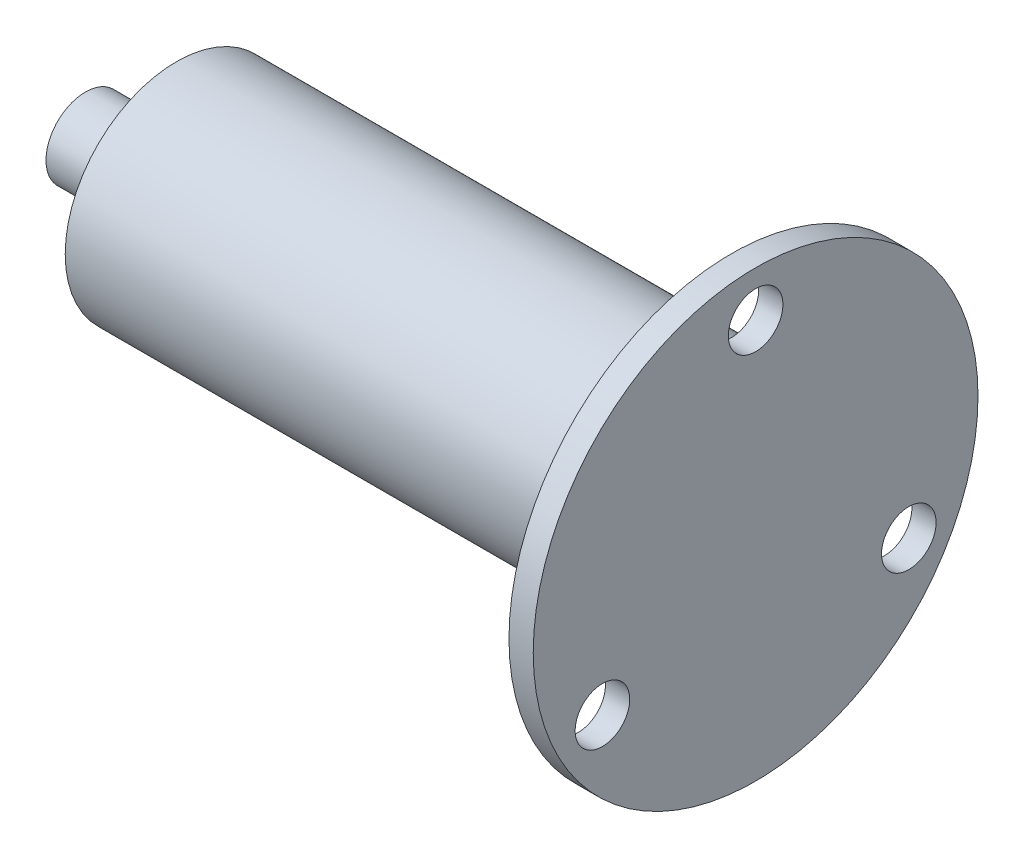
ISO-10303-21;
HEADER;
FILE_DESCRIPTION(('STEP AP214'),'2;1');
FILE_NAME('part.step','',(''),(''),'','','');
FILE_SCHEMA(('AUTOMOTIVE_DESIGN { 1 0 10303 214 1 1 1 1 }'));
ENDSEC;
DATA;
#1=APPLICATION_CONTEXT('core data for automotive mechanical design processes');
#2=APPLICATION_PROTOCOL_DEFINITION('international standard','automotive_design',2000,#1);
#3=PRODUCT_CONTEXT('',#1,'mechanical');
#4=PRODUCT('Part','Part','',(#3));
#5=PRODUCT_RELATED_PRODUCT_CATEGORY('part','',(#4));
#6=PRODUCT_DEFINITION_FORMATION('','',#4);
#7=PRODUCT_DEFINITION_CONTEXT('part definition',#1,'design');
#8=PRODUCT_DEFINITION('design','',#6,#7);
#9=PRODUCT_DEFINITION_SHAPE('','',#8);
#10=(LENGTH_UNIT() NAMED_UNIT(*) SI_UNIT(.MILLI.,.METRE.));
#11=(NAMED_UNIT(*) PLANE_ANGLE_UNIT() SI_UNIT($,.RADIAN.));
#12=(NAMED_UNIT(*) SI_UNIT($,.STERADIAN.) SOLID_ANGLE_UNIT());
#13=UNCERTAINTY_MEASURE_WITH_UNIT(LENGTH_MEASURE(1.E-05),#10,'distance_accuracy_value','');
#14=(GEOMETRIC_REPRESENTATION_CONTEXT(3) GLOBAL_UNCERTAINTY_ASSIGNED_CONTEXT((#13)) GLOBAL_UNIT_ASSIGNED_CONTEXT((#10,
#11,#12)) REPRESENTATION_CONTEXT('',''));
#15=CARTESIAN_POINT('',(0.,0.,0.));
#16=DIRECTION('',(0.,0.,1.));
#17=DIRECTION('',(1.,0.,0.));
#18=AXIS2_PLACEMENT_3D('',#15,#16,#17);
#19=CARTESIAN_POINT('',(0.,0.,0.));
#20=DIRECTION('',(1.,0.,0.));
#21=DIRECTION('',(0.,0.,-1.));
#22=AXIS2_PLACEMENT_3D('',#19,#20,#21);
#23=PLANE('',#22);
#24=CARTESIAN_POINT('',(0.,0.,0.));
#25=DIRECTION('',(-1.,0.,0.));
#26=DIRECTION('',(0.,0.,1.));
#27=AXIS2_PLACEMENT_3D('',#24,#25,#26);
#28=CIRCLE('',#27,3.9);
#29=CARTESIAN_POINT('',(0.,0.,3.9));
#30=VERTEX_POINT('',#29);
#31=EDGE_CURVE('E10',#30,#30,#28,.T.);
#32=ORIENTED_EDGE('',*,*,#31,.T.);
#33=EDGE_LOOP('',(#32));
#34=FACE_BOUND('',#33,.T.);
#35=ADVANCED_FACE('F33',(#34),#23,.F.);
#36=CARTESIAN_POINT('',(0.,0.,0.));
#37=DIRECTION('',(-1.,0.,0.));
#38=DIRECTION('',(0.,0.,1.));
#39=AXIS2_PLACEMENT_3D('',#36,#37,#38);
#40=CYLINDRICAL_SURFACE('',#39,3.9);
#41=ORIENTED_EDGE('',*,*,#31,.F.);
#42=EDGE_LOOP('',(#41));
#43=FACE_BOUND('',#42,.T.);
#44=CARTESIAN_POINT('',(9.,0.,0.));
#45=DIRECTION('',(-1.,0.,0.));
#46=DIRECTION('',(0.,0.,1.));
#47=AXIS2_PLACEMENT_3D('',#44,#45,#46);
#48=CIRCLE('',#47,3.9);
#49=CARTESIAN_POINT('',(9.,0.,3.9));
#50=VERTEX_POINT('',#49);
#51=EDGE_CURVE('E40',#50,#50,#48,.T.);
#52=ORIENTED_EDGE('',*,*,#51,.T.);
#53=EDGE_LOOP('',(#52));
#54=FACE_BOUND('',#53,.T.);
#55=ADVANCED_FACE('F101',(#43,#54),#40,.T.);
#56=CARTESIAN_POINT('',(9.,3.9,0.));
#57=DIRECTION('',(1.,0.,0.));
#58=DIRECTION('',(0.,0.,-1.));
#59=AXIS2_PLACEMENT_3D('',#56,#57,#58);
#60=PLANE('',#59);
#61=ORIENTED_EDGE('',*,*,#51,.F.);
#62=EDGE_LOOP('',(#61));
#63=FACE_BOUND('',#62,.T.);
#64=CARTESIAN_POINT('',(9.,0.,0.));
#65=DIRECTION('',(-1.,0.,0.));
#66=DIRECTION('',(0.,0.,1.));
#67=AXIS2_PLACEMENT_3D('',#64,#65,#66);
#68=CIRCLE('',#67,11.);
#69=CARTESIAN_POINT('',(9.,0.,11.));
#70=VERTEX_POINT('',#69);
#71=EDGE_CURVE('E45',#70,#70,#68,.T.);
#72=ORIENTED_EDGE('',*,*,#71,.T.);
#73=EDGE_LOOP('',(#72));
#74=FACE_BOUND('',#73,.T.);
#75=ADVANCED_FACE('F76',(#63,#74),#60,.F.);
#76=CARTESIAN_POINT('',(0.,0.,0.));
#77=DIRECTION('',(-1.,0.,0.));
#78=DIRECTION('',(0.,0.,1.));
#79=AXIS2_PLACEMENT_3D('',#76,#77,#78);
#80=CYLINDRICAL_SURFACE('',#79,11.);
#81=ORIENTED_EDGE('',*,*,#71,.F.);
#82=EDGE_LOOP('',(#81));
#83=FACE_BOUND('',#82,.T.);
#84=CARTESIAN_POINT('',(63.9,0.,0.));
#85=DIRECTION('',(-1.,0.,0.));
#86=DIRECTION('',(0.,0.,1.));
#87=AXIS2_PLACEMENT_3D('',#84,#85,#86);
#88=CIRCLE('',#87,11.);
#89=CARTESIAN_POINT('',(63.9,0.,11.));
#90=VERTEX_POINT('',#89);
#91=EDGE_CURVE('E66',#90,#90,#88,.T.);
#92=ORIENTED_EDGE('',*,*,#91,.T.);
#93=EDGE_LOOP('',(#92));
#94=FACE_BOUND('',#93,.T.);
#95=ADVANCED_FACE('F78',(#83,#94),#80,.T.);
#96=CARTESIAN_POINT('',(63.9,11.,0.));
#97=DIRECTION('',(1.,0.,0.));
#98=DIRECTION('',(0.,0.,-1.));
#99=AXIS2_PLACEMENT_3D('',#96,#97,#98);
#100=PLANE('',#99);
#101=CARTESIAN_POINT('',(63.9,17.5,0.));
#102=DIRECTION('',(-1.,0.,0.));
#103=DIRECTION('',(0.,0.,1.));
#104=AXIS2_PLACEMENT_3D('',#101,#102,#103);
#105=CIRCLE('',#104,2.7);
#106=CARTESIAN_POINT('',(63.9,17.5,2.7));
#107=VERTEX_POINT('',#106);
#108=EDGE_CURVE('E52',#107,#107,#105,.T.);
#109=ORIENTED_EDGE('',*,*,#108,.F.);
#110=EDGE_LOOP('',(#109));
#111=FACE_BOUND('',#110,.T.);
#112=CARTESIAN_POINT('',(63.9,-8.75,15.1554445662277));
#113=DIRECTION('',(-1.,0.,0.));
#114=DIRECTION('',(0.,0.,1.));
#115=AXIS2_PLACEMENT_3D('',#112,#113,#114);
#116=CIRCLE('',#115,2.7);
#117=CARTESIAN_POINT('',(63.9,-8.75,17.8554445662277));
#118=VERTEX_POINT('',#117);
#119=EDGE_CURVE('E168',#118,#118,#116,.T.);
#120=ORIENTED_EDGE('',*,*,#119,.F.);
#121=EDGE_LOOP('',(#120));
#122=FACE_BOUND('',#121,.T.);
#123=CARTESIAN_POINT('',(63.9,-8.75000000000001,-15.1554445662277));
#124=DIRECTION('',(-1.,0.,0.));
#125=DIRECTION('',(0.,0.,1.));
#126=AXIS2_PLACEMENT_3D('',#123,#124,#125);
#127=CIRCLE('',#126,2.7);
#128=CARTESIAN_POINT('',(63.9,-8.75000000000001,-12.4554445662277));
#129=VERTEX_POINT('',#128);
#130=EDGE_CURVE('E69',#129,#129,#127,.T.);
#131=ORIENTED_EDGE('',*,*,#130,.F.);
#132=EDGE_LOOP('',(#131));
#133=FACE_BOUND('',#132,.T.);
#134=ORIENTED_EDGE('',*,*,#91,.F.);
#135=EDGE_LOOP('',(#134));
#136=FACE_BOUND('',#135,.T.);
#137=CARTESIAN_POINT('',(63.9,0.,0.));
#138=DIRECTION('',(-1.,0.,0.));
#139=DIRECTION('',(0.,0.,1.));
#140=AXIS2_PLACEMENT_3D('',#137,#138,#139);
#141=CIRCLE('',#140,22.);
#142=CARTESIAN_POINT('',(63.9,0.,22.));
#143=VERTEX_POINT('',#142);
#144=EDGE_CURVE('E61',#143,#143,#141,.T.);
#145=ORIENTED_EDGE('',*,*,#144,.T.);
#146=EDGE_LOOP('',(#145));
#147=FACE_BOUND('',#146,.T.);
#148=ADVANCED_FACE('F81',(#111,#122,#133,#136,#147),#100,.F.);
#149=CARTESIAN_POINT('',(0.,0.,0.));
#150=DIRECTION('',(-1.,0.,0.));
#151=DIRECTION('',(0.,0.,1.));
#152=AXIS2_PLACEMENT_3D('',#149,#150,#151);
#153=CYLINDRICAL_SURFACE('',#152,22.);
#154=ORIENTED_EDGE('',*,*,#144,.F.);
#155=EDGE_LOOP('',(#154));
#156=FACE_BOUND('',#155,.T.);
#157=CARTESIAN_POINT('',(66.3,0.,0.));
#158=DIRECTION('',(-1.,0.,0.));
#159=DIRECTION('',(0.,0.,1.));
#160=AXIS2_PLACEMENT_3D('',#157,#158,#159);
#161=CIRCLE('',#160,22.);
#162=CARTESIAN_POINT('',(66.3,0.,22.));
#163=VERTEX_POINT('',#162);
#164=EDGE_CURVE('E57',#163,#163,#161,.T.);
#165=ORIENTED_EDGE('',*,*,#164,.T.);
#166=EDGE_LOOP('',(#165));
#167=FACE_BOUND('',#166,.T.);
#168=ADVANCED_FACE('F87',(#156,#167),#153,.T.);
#169=CARTESIAN_POINT('',(66.3,11.,0.));
#170=DIRECTION('',(-1.,0.,0.));
#171=DIRECTION('',(0.,0.,1.));
#172=AXIS2_PLACEMENT_3D('',#169,#170,#171);
#173=PLANE('',#172);
#174=CARTESIAN_POINT('',(66.3,17.5,0.));
#175=DIRECTION('',(-1.,0.,0.));
#176=DIRECTION('',(0.,0.,1.));
#177=AXIS2_PLACEMENT_3D('',#174,#175,#176);
#178=CIRCLE('',#177,2.7);
#179=CARTESIAN_POINT('',(66.3,17.5,2.7));
#180=VERTEX_POINT('',#179);
#181=EDGE_CURVE('E36',#180,#180,#178,.T.);
#182=ORIENTED_EDGE('',*,*,#181,.T.);
#183=EDGE_LOOP('',(#182));
#184=FACE_BOUND('',#183,.T.);
#185=CARTESIAN_POINT('',(66.3,-8.75,15.1554445662277));
#186=DIRECTION('',(-1.,0.,0.));
#187=DIRECTION('',(0.,0.,1.));
#188=AXIS2_PLACEMENT_3D('',#185,#186,#187);
#189=CIRCLE('',#188,2.7);
#190=CARTESIAN_POINT('',(66.3,-8.75,17.8554445662277));
#191=VERTEX_POINT('',#190);
#192=EDGE_CURVE('E51',#191,#191,#189,.T.);
#193=ORIENTED_EDGE('',*,*,#192,.T.);
#194=EDGE_LOOP('',(#193));
#195=FACE_BOUND('',#194,.T.);
#196=CARTESIAN_POINT('',(66.3,-8.75000000000001,-15.1554445662277));
#197=DIRECTION('',(-1.,0.,0.));
#198=DIRECTION('',(0.,0.,1.));
#199=AXIS2_PLACEMENT_3D('',#196,#197,#198);
#200=CIRCLE('',#199,2.7);
#201=CARTESIAN_POINT('',(66.3,-8.75000000000001,-12.4554445662277));
#202=VERTEX_POINT('',#201);
#203=EDGE_CURVE('E49',#202,#202,#200,.T.);
#204=ORIENTED_EDGE('',*,*,#203,.T.);
#205=EDGE_LOOP('',(#204));
#206=FACE_BOUND('',#205,.T.);
#207=ORIENTED_EDGE('',*,*,#164,.F.);
#208=EDGE_LOOP('',(#207));
#209=FACE_BOUND('',#208,.T.);
#210=ADVANCED_FACE('F93',(#184,#195,#206,#209),#173,.F.);
#211=CARTESIAN_POINT('',(73.9,-8.75000000000001,-15.1554445662277));
#212=DIRECTION('',(-1.,0.,0.));
#213=DIRECTION('',(0.,0.,1.));
#214=AXIS2_PLACEMENT_3D('',#211,#212,#213);
#215=CYLINDRICAL_SURFACE('',#214,2.7);
#216=ORIENTED_EDGE('',*,*,#130,.T.);
#217=EDGE_LOOP('',(#216));
#218=FACE_BOUND('',#217,.T.);
#219=ORIENTED_EDGE('',*,*,#203,.F.);
#220=EDGE_LOOP('',(#219));
#221=FACE_BOUND('',#220,.T.);
#222=ADVANCED_FACE('F98',(#218,#221),#215,.F.);
#223=CARTESIAN_POINT('',(73.9,-8.75,15.1554445662277));
#224=DIRECTION('',(-1.,0.,0.));
#225=DIRECTION('',(0.,0.,1.));
#226=AXIS2_PLACEMENT_3D('',#223,#224,#225);
#227=CYLINDRICAL_SURFACE('',#226,2.7);
#228=ORIENTED_EDGE('',*,*,#119,.T.);
#229=EDGE_LOOP('',(#228));
#230=FACE_BOUND('',#229,.T.);
#231=ORIENTED_EDGE('',*,*,#192,.F.);
#232=EDGE_LOOP('',(#231));
#233=FACE_BOUND('',#232,.T.);
#234=ADVANCED_FACE('F141',(#230,#233),#227,.F.);
#235=CARTESIAN_POINT('',(73.9,17.5,0.));
#236=DIRECTION('',(-1.,0.,0.));
#237=DIRECTION('',(0.,0.,1.));
#238=AXIS2_PLACEMENT_3D('',#235,#236,#237);
#239=CYLINDRICAL_SURFACE('',#238,2.7);
#240=ORIENTED_EDGE('',*,*,#108,.T.);
#241=EDGE_LOOP('',(#240));
#242=FACE_BOUND('',#241,.T.);
#243=ORIENTED_EDGE('',*,*,#181,.F.);
#244=EDGE_LOOP('',(#243));
#245=FACE_BOUND('',#244,.T.);
#246=ADVANCED_FACE('F151',(#242,#245),#239,.F.);
#247=CLOSED_SHELL('',(#35,#55,#75,#95,#148,#168,#210,#222,#234,#246));
#248=MANIFOLD_SOLID_BREP('B2',#247);
#249=ADVANCED_BREP_SHAPE_REPRESENTATION('',(#18,#248),#14);
#250=SHAPE_DEFINITION_REPRESENTATION(#9,#249);
ENDSEC;
END-ISO-10303-21;
